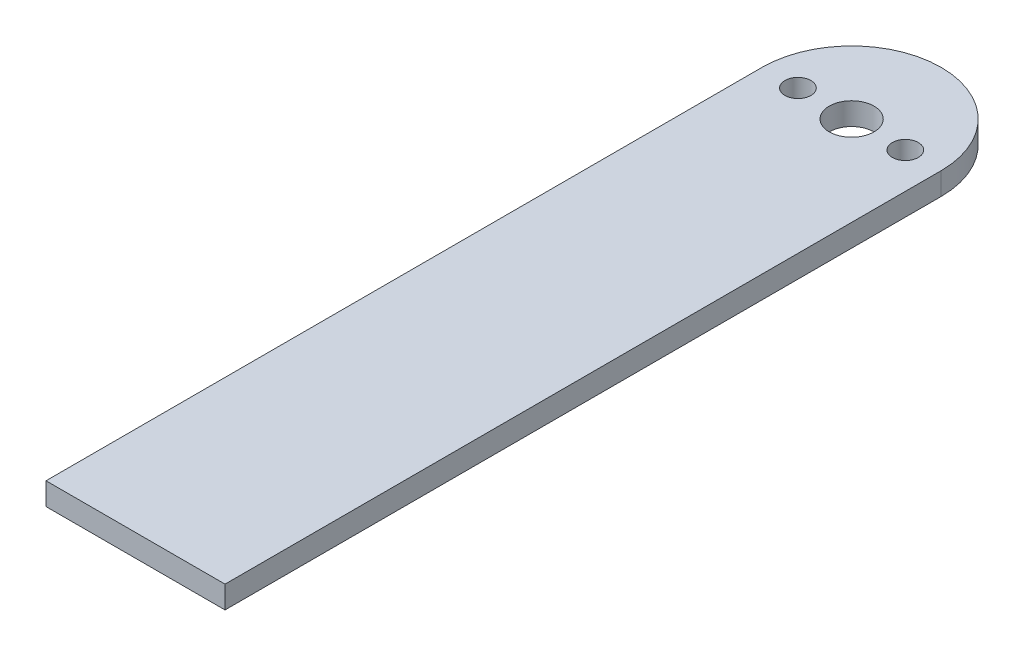
ISO-10303-21;
HEADER;
FILE_DESCRIPTION(('STEP AP214'),'2;1');
FILE_NAME('part.step','',(''),(''),'','','');
FILE_SCHEMA(('AUTOMOTIVE_DESIGN { 1 0 10303 214 1 1 1 1 }'));
ENDSEC;
DATA;
#1=APPLICATION_CONTEXT('core data for automotive mechanical design processes');
#2=APPLICATION_PROTOCOL_DEFINITION('international standard','automotive_design',2000,#1);
#3=PRODUCT_CONTEXT('',#1,'mechanical');
#4=PRODUCT('Part','Part','',(#3));
#5=PRODUCT_RELATED_PRODUCT_CATEGORY('part','',(#4));
#6=PRODUCT_DEFINITION_FORMATION('','',#4);
#7=PRODUCT_DEFINITION_CONTEXT('part definition',#1,'design');
#8=PRODUCT_DEFINITION('design','',#6,#7);
#9=PRODUCT_DEFINITION_SHAPE('','',#8);
#10=(LENGTH_UNIT() NAMED_UNIT(*) SI_UNIT(.MILLI.,.METRE.));
#11=(NAMED_UNIT(*) PLANE_ANGLE_UNIT() SI_UNIT($,.RADIAN.));
#12=(NAMED_UNIT(*) SI_UNIT($,.STERADIAN.) SOLID_ANGLE_UNIT());
#13=UNCERTAINTY_MEASURE_WITH_UNIT(LENGTH_MEASURE(1.E-05),#10,'distance_accuracy_value','');
#14=(GEOMETRIC_REPRESENTATION_CONTEXT(3) GLOBAL_UNCERTAINTY_ASSIGNED_CONTEXT((#13)) GLOBAL_UNIT_ASSIGNED_CONTEXT((#10,
#11,#12)) REPRESENTATION_CONTEXT('',''));
#15=CARTESIAN_POINT('',(0.,0.,0.));
#16=DIRECTION('',(0.,0.,1.));
#17=DIRECTION('',(1.,0.,0.));
#18=AXIS2_PLACEMENT_3D('',#15,#16,#17);
#19=CARTESIAN_POINT('',(0.,3.175,0.));
#20=DIRECTION('',(0.,1.,0.));
#21=DIRECTION('',(0.,0.,1.));
#22=AXIS2_PLACEMENT_3D('',#19,#20,#21);
#23=PLANE('',#22);
#24=CARTESIAN_POINT('',(-7.62,3.175,0.));
#25=DIRECTION('',(0.,1.,0.));
#26=DIRECTION('',(0.,0.,1.));
#27=AXIS2_PLACEMENT_3D('',#24,#25,#26);
#28=CIRCLE('',#27,1.8415);
#29=CARTESIAN_POINT('',(-7.62,3.175,1.8415));
#30=VERTEX_POINT('',#29);
#31=EDGE_CURVE('E138',#30,#30,#28,.T.);
#32=ORIENTED_EDGE('',*,*,#31,.F.);
#33=EDGE_LOOP('',(#32));
#34=FACE_BOUND('',#33,.T.);
#35=CARTESIAN_POINT('',(0.,3.175,0.));
#36=DIRECTION('',(0.,1.,0.));
#37=DIRECTION('',(0.,0.,1.));
#38=AXIS2_PLACEMENT_3D('',#35,#36,#37);
#39=CIRCLE('',#38,12.7);
#40=CARTESIAN_POINT('',(12.7,3.175,0.));
#41=VERTEX_POINT('',#40);
#42=CARTESIAN_POINT('',(-12.7,3.175,0.));
#43=VERTEX_POINT('',#42);
#44=EDGE_CURVE('E96',#41,#43,#39,.T.);
#45=ORIENTED_EDGE('',*,*,#44,.T.);
#46=DIRECTION('',(0.,0.,1.));
#47=VECTOR('',#46,1.);
#48=CARTESIAN_POINT('',(-12.7,3.175,0.));
#49=LINE('',#48,#47);
#50=CARTESIAN_POINT('',(-12.7,3.175,101.6));
#51=VERTEX_POINT('',#50);
#52=EDGE_CURVE('E91',#43,#51,#49,.T.);
#53=ORIENTED_EDGE('',*,*,#52,.T.);
#54=DIRECTION('',(1.,0.,0.));
#55=VECTOR('',#54,1.);
#56=CARTESIAN_POINT('',(-12.7,3.175,101.6));
#57=LINE('',#56,#55);
#58=CARTESIAN_POINT('',(12.7,3.175,101.6));
#59=VERTEX_POINT('',#58);
#60=EDGE_CURVE('E94',#51,#59,#57,.T.);
#61=ORIENTED_EDGE('',*,*,#60,.T.);
#62=DIRECTION('',(0.,0.,-1.));
#63=VECTOR('',#62,1.);
#64=CARTESIAN_POINT('',(12.7,3.175,0.));
#65=LINE('',#64,#63);
#66=EDGE_CURVE('E61',#59,#41,#65,.T.);
#67=ORIENTED_EDGE('',*,*,#66,.T.);
#68=EDGE_LOOP('',(#45,#53,#61,#67));
#69=FACE_BOUND('',#68,.T.);
#70=CARTESIAN_POINT('',(0.,3.175,0.));
#71=DIRECTION('',(0.,1.,0.));
#72=DIRECTION('',(0.,0.,1.));
#73=AXIS2_PLACEMENT_3D('',#70,#71,#72);
#74=CIRCLE('',#73,3.175);
#75=CARTESIAN_POINT('',(0.,3.175,3.175));
#76=VERTEX_POINT('',#75);
#77=EDGE_CURVE('E116',#76,#76,#74,.T.);
#78=ORIENTED_EDGE('',*,*,#77,.F.);
#79=EDGE_LOOP('',(#78));
#80=FACE_BOUND('',#79,.T.);
#81=CARTESIAN_POINT('',(7.62,3.175,0.));
#82=DIRECTION('',(0.,1.,0.));
#83=DIRECTION('',(0.,0.,1.));
#84=AXIS2_PLACEMENT_3D('',#81,#82,#83);
#85=CIRCLE('',#84,1.8415);
#86=CARTESIAN_POINT('',(7.62,3.175,1.8415));
#87=VERTEX_POINT('',#86);
#88=EDGE_CURVE('E146',#87,#87,#85,.T.);
#89=ORIENTED_EDGE('',*,*,#88,.F.);
#90=EDGE_LOOP('',(#89));
#91=FACE_BOUND('',#90,.T.);
#92=ADVANCED_FACE('F43',(#34,#69,#80,#91),#23,.T.);
#93=CARTESIAN_POINT('',(0.,0.,0.));
#94=DIRECTION('',(0.,1.,0.));
#95=DIRECTION('',(0.,0.,1.));
#96=AXIS2_PLACEMENT_3D('',#93,#94,#95);
#97=PLANE('',#96);
#98=CARTESIAN_POINT('',(0.,0.,0.));
#99=DIRECTION('',(0.,1.,0.));
#100=DIRECTION('',(0.,0.,1.));
#101=AXIS2_PLACEMENT_3D('',#98,#99,#100);
#102=CIRCLE('',#101,12.7);
#103=CARTESIAN_POINT('',(12.7,0.,0.));
#104=VERTEX_POINT('',#103);
#105=CARTESIAN_POINT('',(-12.7,0.,0.));
#106=VERTEX_POINT('',#105);
#107=EDGE_CURVE('E112',#104,#106,#102,.T.);
#108=ORIENTED_EDGE('',*,*,#107,.F.);
#109=DIRECTION('',(0.,0.,-1.));
#110=VECTOR('',#109,1.);
#111=CARTESIAN_POINT('',(12.7,0.,0.));
#112=LINE('',#111,#110);
#113=CARTESIAN_POINT('',(12.7,0.,101.6));
#114=VERTEX_POINT('',#113);
#115=EDGE_CURVE('E84',#114,#104,#112,.T.);
#116=ORIENTED_EDGE('',*,*,#115,.F.);
#117=DIRECTION('',(1.,0.,0.));
#118=VECTOR('',#117,1.);
#119=CARTESIAN_POINT('',(-12.7,0.,101.6));
#120=LINE('',#119,#118);
#121=CARTESIAN_POINT('',(-12.7,0.,101.6));
#122=VERTEX_POINT('',#121);
#123=EDGE_CURVE('E78',#122,#114,#120,.T.);
#124=ORIENTED_EDGE('',*,*,#123,.F.);
#125=DIRECTION('',(0.,0.,1.));
#126=VECTOR('',#125,1.);
#127=CARTESIAN_POINT('',(-12.7,0.,0.));
#128=LINE('',#127,#126);
#129=EDGE_CURVE('E101',#106,#122,#128,.T.);
#130=ORIENTED_EDGE('',*,*,#129,.F.);
#131=EDGE_LOOP('',(#108,#116,#124,#130));
#132=FACE_BOUND('',#131,.T.);
#133=CARTESIAN_POINT('',(0.,0.,0.));
#134=DIRECTION('',(0.,1.,0.));
#135=DIRECTION('',(0.,0.,1.));
#136=AXIS2_PLACEMENT_3D('',#133,#134,#135);
#137=CIRCLE('',#136,3.175);
#138=CARTESIAN_POINT('',(0.,0.,3.175));
#139=VERTEX_POINT('',#138);
#140=EDGE_CURVE('E134',#139,#139,#137,.T.);
#141=ORIENTED_EDGE('',*,*,#140,.T.);
#142=EDGE_LOOP('',(#141));
#143=FACE_BOUND('',#142,.T.);
#144=CARTESIAN_POINT('',(-7.62,0.,0.));
#145=DIRECTION('',(0.,1.,0.));
#146=DIRECTION('',(0.,0.,1.));
#147=AXIS2_PLACEMENT_3D('',#144,#145,#146);
#148=CIRCLE('',#147,1.8415);
#149=CARTESIAN_POINT('',(-7.62,0.,1.8415));
#150=VERTEX_POINT('',#149);
#151=EDGE_CURVE('E142',#150,#150,#148,.T.);
#152=ORIENTED_EDGE('',*,*,#151,.T.);
#153=EDGE_LOOP('',(#152));
#154=FACE_BOUND('',#153,.T.);
#155=CARTESIAN_POINT('',(7.62,0.,0.));
#156=DIRECTION('',(0.,1.,0.));
#157=DIRECTION('',(0.,0.,1.));
#158=AXIS2_PLACEMENT_3D('',#155,#156,#157);
#159=CIRCLE('',#158,1.8415);
#160=CARTESIAN_POINT('',(7.62,0.,1.8415));
#161=VERTEX_POINT('',#160);
#162=EDGE_CURVE('E150',#161,#161,#159,.T.);
#163=ORIENTED_EDGE('',*,*,#162,.T.);
#164=EDGE_LOOP('',(#163));
#165=FACE_BOUND('',#164,.T.);
#166=ADVANCED_FACE('F129',(#132,#143,#154,#165),#97,.F.);
#167=CARTESIAN_POINT('',(0.,3.175,0.));
#168=DIRECTION('',(0.,-1.,0.));
#169=DIRECTION('',(0.,0.,-1.));
#170=AXIS2_PLACEMENT_3D('',#167,#168,#169);
#171=CYLINDRICAL_SURFACE('',#170,12.7);
#172=ORIENTED_EDGE('',*,*,#107,.T.);
#173=DIRECTION('',(0.,-1.,0.));
#174=VECTOR('',#173,1.);
#175=CARTESIAN_POINT('',(-12.7,3.175,0.));
#176=LINE('',#175,#174);
#177=EDGE_CURVE('E11',#43,#106,#176,.T.);
#178=ORIENTED_EDGE('',*,*,#177,.F.);
#179=ORIENTED_EDGE('',*,*,#44,.F.);
#180=DIRECTION('',(0.,-1.,0.));
#181=VECTOR('',#180,1.);
#182=CARTESIAN_POINT('',(12.7,3.175,0.));
#183=LINE('',#182,#181);
#184=EDGE_CURVE('E108',#41,#104,#183,.T.);
#185=ORIENTED_EDGE('',*,*,#184,.T.);
#186=EDGE_LOOP('',(#172,#178,#179,#185));
#187=FACE_BOUND('',#186,.T.);
#188=ADVANCED_FACE('F45',(#187),#171,.T.);
#189=CARTESIAN_POINT('',(-12.7,3.175,0.));
#190=DIRECTION('',(1.,0.,0.));
#191=DIRECTION('',(0.,0.,-1.));
#192=AXIS2_PLACEMENT_3D('',#189,#190,#191);
#193=PLANE('',#192);
#194=ORIENTED_EDGE('',*,*,#129,.T.);
#195=DIRECTION('',(0.,-1.,0.));
#196=VECTOR('',#195,1.);
#197=CARTESIAN_POINT('',(-12.7,3.175,101.6));
#198=LINE('',#197,#196);
#199=EDGE_CURVE('E53',#51,#122,#198,.T.);
#200=ORIENTED_EDGE('',*,*,#199,.F.);
#201=ORIENTED_EDGE('',*,*,#52,.F.);
#202=ORIENTED_EDGE('',*,*,#177,.T.);
#203=EDGE_LOOP('',(#194,#200,#201,#202));
#204=FACE_BOUND('',#203,.T.);
#205=ADVANCED_FACE('F100',(#204),#193,.F.);
#206=CARTESIAN_POINT('',(-12.7,3.175,101.6));
#207=DIRECTION('',(0.,0.,-1.));
#208=DIRECTION('',(-1.,0.,0.));
#209=AXIS2_PLACEMENT_3D('',#206,#207,#208);
#210=PLANE('',#209);
#211=ORIENTED_EDGE('',*,*,#123,.T.);
#212=DIRECTION('',(0.,-1.,0.));
#213=VECTOR('',#212,1.);
#214=CARTESIAN_POINT('',(12.7,3.175,101.6));
#215=LINE('',#214,#213);
#216=EDGE_CURVE('E103',#59,#114,#215,.T.);
#217=ORIENTED_EDGE('',*,*,#216,.F.);
#218=ORIENTED_EDGE('',*,*,#60,.F.);
#219=ORIENTED_EDGE('',*,*,#199,.T.);
#220=EDGE_LOOP('',(#211,#217,#218,#219));
#221=FACE_BOUND('',#220,.T.);
#222=ADVANCED_FACE('F104',(#221),#210,.F.);
#223=CARTESIAN_POINT('',(12.7,3.175,0.));
#224=DIRECTION('',(-1.,0.,0.));
#225=DIRECTION('',(0.,0.,1.));
#226=AXIS2_PLACEMENT_3D('',#223,#224,#225);
#227=PLANE('',#226);
#228=ORIENTED_EDGE('',*,*,#115,.T.);
#229=ORIENTED_EDGE('',*,*,#184,.F.);
#230=ORIENTED_EDGE('',*,*,#66,.F.);
#231=ORIENTED_EDGE('',*,*,#216,.T.);
#232=EDGE_LOOP('',(#228,#229,#230,#231));
#233=FACE_BOUND('',#232,.T.);
#234=ADVANCED_FACE('F126',(#233),#227,.F.);
#235=CARTESIAN_POINT('',(0.,3.175,0.));
#236=DIRECTION('',(0.,-1.,0.));
#237=DIRECTION('',(0.,0.,-1.));
#238=AXIS2_PLACEMENT_3D('',#235,#236,#237);
#239=CYLINDRICAL_SURFACE('',#238,3.175);
#240=ORIENTED_EDGE('',*,*,#77,.T.);
#241=EDGE_LOOP('',(#240));
#242=FACE_BOUND('',#241,.T.);
#243=ORIENTED_EDGE('',*,*,#140,.F.);
#244=EDGE_LOOP('',(#243));
#245=FACE_BOUND('',#244,.T.);
#246=ADVANCED_FACE('F170',(#242,#245),#239,.F.);
#247=CARTESIAN_POINT('',(-7.62,3.175,0.));
#248=DIRECTION('',(0.,-1.,0.));
#249=DIRECTION('',(0.,0.,-1.));
#250=AXIS2_PLACEMENT_3D('',#247,#248,#249);
#251=CYLINDRICAL_SURFACE('',#250,1.8415);
#252=ORIENTED_EDGE('',*,*,#31,.T.);
#253=EDGE_LOOP('',(#252));
#254=FACE_BOUND('',#253,.T.);
#255=ORIENTED_EDGE('',*,*,#151,.F.);
#256=EDGE_LOOP('',(#255));
#257=FACE_BOUND('',#256,.T.);
#258=ADVANCED_FACE('F224',(#254,#257),#251,.F.);
#259=CARTESIAN_POINT('',(7.62,3.175,0.));
#260=DIRECTION('',(0.,-1.,0.));
#261=DIRECTION('',(0.,0.,-1.));
#262=AXIS2_PLACEMENT_3D('',#259,#260,#261);
#263=CYLINDRICAL_SURFACE('',#262,1.8415);
#264=ORIENTED_EDGE('',*,*,#88,.T.);
#265=EDGE_LOOP('',(#264));
#266=FACE_BOUND('',#265,.T.);
#267=ORIENTED_EDGE('',*,*,#162,.F.);
#268=EDGE_LOOP('',(#267));
#269=FACE_BOUND('',#268,.T.);
#270=ADVANCED_FACE('F158',(#266,#269),#263,.F.);
#271=CLOSED_SHELL('',(#92,#166,#188,#205,#222,#234,#246,#258,#270));
#272=MANIFOLD_SOLID_BREP('B2',#271);
#273=ADVANCED_BREP_SHAPE_REPRESENTATION('',(#18,#272),#14);
#274=SHAPE_DEFINITION_REPRESENTATION(#9,#273);
ENDSEC;
END-ISO-10303-21;
